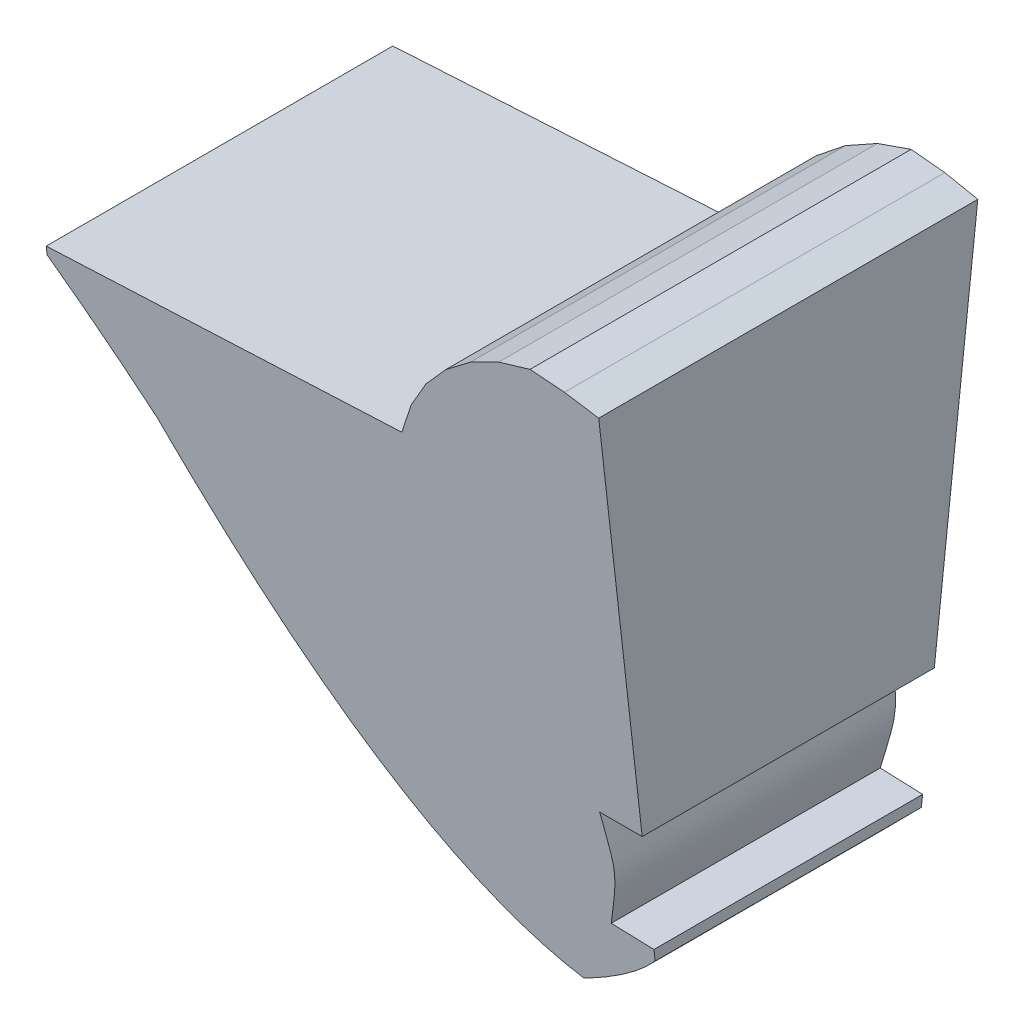
ISO-10303-21;
HEADER;
FILE_DESCRIPTION(('STEP AP214'),'2;1');
FILE_NAME('part.step','',(''),(''),'','','');
FILE_SCHEMA(('AUTOMOTIVE_DESIGN { 1 0 10303 214 1 1 1 1 }'));
ENDSEC;
DATA;
#1=APPLICATION_CONTEXT('core data for automotive mechanical design processes');
#2=APPLICATION_PROTOCOL_DEFINITION('international standard','automotive_design',2000,#1);
#3=PRODUCT_CONTEXT('',#1,'mechanical');
#4=PRODUCT('Part','Part','',(#3));
#5=PRODUCT_RELATED_PRODUCT_CATEGORY('part','',(#4));
#6=PRODUCT_DEFINITION_FORMATION('','',#4);
#7=PRODUCT_DEFINITION_CONTEXT('part definition',#1,'design');
#8=PRODUCT_DEFINITION('design','',#6,#7);
#9=PRODUCT_DEFINITION_SHAPE('','',#8);
#10=(LENGTH_UNIT() NAMED_UNIT(*) SI_UNIT(.MILLI.,.METRE.));
#11=(NAMED_UNIT(*) PLANE_ANGLE_UNIT() SI_UNIT($,.RADIAN.));
#12=(NAMED_UNIT(*) SI_UNIT($,.STERADIAN.) SOLID_ANGLE_UNIT());
#13=UNCERTAINTY_MEASURE_WITH_UNIT(LENGTH_MEASURE(1.E-05),#10,'distance_accuracy_value','');
#14=(GEOMETRIC_REPRESENTATION_CONTEXT(3) GLOBAL_UNCERTAINTY_ASSIGNED_CONTEXT((#13)) GLOBAL_UNIT_ASSIGNED_CONTEXT((#10,
#11,#12)) REPRESENTATION_CONTEXT('',''));
#15=CARTESIAN_POINT('',(0.,0.,0.));
#16=DIRECTION('',(0.,0.,1.));
#17=DIRECTION('',(1.,0.,0.));
#18=AXIS2_PLACEMENT_3D('',#15,#16,#17);
#19=CARTESIAN_POINT('',(0.355125000055651,-1.23774703808888E-13,7.21));
#20=DIRECTION('',(-1.,3.48538412642003E-13,0.));
#21=DIRECTION('',(-3.48538412642003E-13,-1.,0.));
#22=AXIS2_PLACEMENT_3D('',#19,#20,#21);
#23=PLANE('',#22);
#24=DIRECTION('',(0.,-0.993653373689782,0.112485434412263));
#25=VECTOR('',#24,1.);
#26=CARTESIAN_POINT('',(0.355125000056697,12.6081551722012,-7.21));
#27=LINE('',#26,#25);
#28=CARTESIAN_POINT('',(0.355125000056697,17.7734661064821,-7.79473332824248));
#29=VERTEX_POINT('',#28);
#30=CARTESIAN_POINT('',(0.355125000056447,1.97626956518499,-6.00642911422341));
#31=VERTEX_POINT('',#30);
#32=EDGE_CURVE('E56',#29,#31,#27,.T.);
#33=ORIENTED_EDGE('',*,*,#32,.F.);
#34=DIRECTION('',(0.,0.,-1.));
#35=VECTOR('',#34,1.);
#36=CARTESIAN_POINT('',(0.355125000056697,17.7734661064821,25.2255551646788));
#37=LINE('',#36,#35);
#38=CARTESIAN_POINT('',(0.355125000056697,17.7734661064821,7.79473332824248));
#39=VERTEX_POINT('',#38);
#40=EDGE_CURVE('E195',#39,#29,#37,.T.);
#41=ORIENTED_EDGE('',*,*,#40,.F.);
#42=DIRECTION('',(0.,0.993653373689782,0.112485434412263));
#43=VECTOR('',#42,1.);
#44=CARTESIAN_POINT('',(0.355125000056697,12.6081551722012,7.21));
#45=LINE('',#44,#43);
#46=CARTESIAN_POINT('',(0.355125000056697,1.97626956518499,6.00642911422342));
#47=VERTEX_POINT('',#46);
#48=EDGE_CURVE('E242',#47,#39,#45,.T.);
#49=ORIENTED_EDGE('',*,*,#48,.F.);
#50=DIRECTION('',(0.,0.,-1.));
#51=VECTOR('',#50,1.);
#52=CARTESIAN_POINT('',(0.355125000056447,1.97626956518499,7.21));
#53=LINE('',#52,#51);
#54=EDGE_CURVE('E319',#47,#31,#53,.T.);
#55=ORIENTED_EDGE('',*,*,#54,.T.);
#56=EDGE_LOOP('',(#33,#41,#49,#55));
#57=FACE_BOUND('',#56,.T.);
#58=ADVANCED_FACE('F45',(#57),#23,.F.);
#59=CARTESIAN_POINT('',(-23.0359211456035,0.,7.21));
#60=DIRECTION('',(-1.,0.,0.));
#61=DIRECTION('',(0.,0.,1.));
#62=AXIS2_PLACEMENT_3D('',#59,#60,#61);
#63=PLANE('',#62);
#64=DIRECTION('',(0.,0.,-1.));
#65=VECTOR('',#64,1.);
#66=CARTESIAN_POINT('',(-23.0359211456035,11.8716122879342,7.21));
#67=LINE('',#66,#65);
#68=CARTESIAN_POINT('',(-23.0359211456035,11.8716122879342,7.12662047501294));
#69=VERTEX_POINT('',#68);
#70=CARTESIAN_POINT('',(-23.0359211456035,11.8716122879342,-7.12662047501294));
#71=VERTEX_POINT('',#70);
#72=EDGE_CURVE('E321',#69,#71,#67,.T.);
#73=ORIENTED_EDGE('',*,*,#72,.T.);
#74=DIRECTION('',(0.,-0.993653373689782,0.112485434412263));
#75=VECTOR('',#74,1.);
#76=CARTESIAN_POINT('',(-23.0359211456035,12.6081551722012,-7.21));
#77=LINE('',#76,#75);
#78=CARTESIAN_POINT('',(-23.0359211456035,11.5401378200982,-7.08909627341673));
#79=VERTEX_POINT('',#78);
#80=EDGE_CURVE('E237',#71,#79,#77,.T.);
#81=ORIENTED_EDGE('',*,*,#80,.T.);
#82=DIRECTION('',(0.,0.,-1.));
#83=VECTOR('',#82,1.);
#84=CARTESIAN_POINT('',(-23.0359211456035,11.5401378200983,7.21));
#85=LINE('',#84,#83);
#86=CARTESIAN_POINT('',(-23.0359211456035,11.5401378200982,7.08909627341673));
#87=VERTEX_POINT('',#86);
#88=EDGE_CURVE('E320',#87,#79,#85,.T.);
#89=ORIENTED_EDGE('',*,*,#88,.F.);
#90=DIRECTION('',(0.,0.993653373689782,0.112485434412263));
#91=VECTOR('',#90,1.);
#92=CARTESIAN_POINT('',(-23.0359211456035,12.6081551722012,7.21));
#93=LINE('',#92,#91);
#94=EDGE_CURVE('E225',#87,#69,#93,.T.);
#95=ORIENTED_EDGE('',*,*,#94,.T.);
#96=EDGE_LOOP('',(#73,#81,#89,#95));
#97=FACE_BOUND('',#96,.T.);
#98=ADVANCED_FACE('F406',(#97),#63,.T.);
#99=CARTESIAN_POINT('',(-18.9451921135982,7.54091889574655,7.21));
#100=CARTESIAN_POINT('',(-10.2150083842792,-3.69764410322756,7.21));
#101=CARTESIAN_POINT('',(-2.84660482498738,-5.05908110388432,7.21));
#102=(BOUNDED_CURVE() B_SPLINE_CURVE(2,(#99,#100,#101),.UNSPECIFIED.,.F.,
.F.) B_SPLINE_CURVE_WITH_KNOTS((3,3),(0.497667241108509,0.499554279588011),
.UNSPECIFIED.) CURVE() GEOMETRIC_REPRESENTATION_ITEM() RATIONAL_B_SPLINE_CURVE((1.,1.,1.)) REPRESENTATION_ITEM(''));
#103=DIRECTION('',(0.,0.,-1.));
#104=VECTOR('',#103,1.);
#105=SURFACE_OF_LINEAR_EXTRUSION('',#102,#104);
#106=DIRECTION('',(0.,0.,-1.));
#107=VECTOR('',#106,1.);
#108=CARTESIAN_POINT('',(-18.9451921135982,7.54091889574657,7.21));
#109=LINE('',#108,#107);
#110=CARTESIAN_POINT('',(-18.9451921135982,7.54091889574657,6.63636910524442));
#111=VERTEX_POINT('',#110);
#112=CARTESIAN_POINT('',(-18.9451921135982,7.54091889574657,-6.63636910524442));
#113=VERTEX_POINT('',#112);
#114=EDGE_CURVE('E311',#111,#113,#109,.T.);
#115=ORIENTED_EDGE('',*,*,#114,.T.);
#116=CARTESIAN_POINT('',(-18.9451921135982,7.54091889574655,-6.63636910524441));
#117=CARTESIAN_POINT('',(-18.7033608655423,7.22962108931645,-6.60112898035273));
#118=CARTESIAN_POINT('',(-18.4592647140916,6.9200497206851,-6.56608429494821));
#119=CARTESIAN_POINT('',(-17.9661198805234,6.30464603742845,-6.49641819962467));
#120=CARTESIAN_POINT('',(-17.7170694462669,5.99881510969872,-6.46179694670763));
#121=CARTESIAN_POINT('',(-17.2137366178937,5.3913665824337,-6.39303140604553));
#122=CARTESIAN_POINT('',(-16.9594535947769,5.08974949683998,-6.35888717648066));
#123=CARTESIAN_POINT('',(-16.4451285665965,4.49103725761873,-6.29111061767257));
#124=CARTESIAN_POINT('',(-16.1850826962375,4.19394537928884,-6.25747865920581));
#125=CARTESIAN_POINT('',(-15.6590118901181,3.60508061675355,-6.1908168731366));
#126=CARTESIAN_POINT('',(-15.3929875534481,3.31330720485499,-6.15778698579723));
#127=CARTESIAN_POINT('',(-14.8544901847056,2.7357195544677,-6.09240181277284));
#128=CARTESIAN_POINT('',(-14.5820174931064,2.44990500284308,-6.06004649163962));
#129=CARTESIAN_POINT('',(-13.9777704357619,1.83142011947111,-5.99003159245484));
#130=CARTESIAN_POINT('',(-13.6445482479649,1.50014167377654,-5.95252958132897));
#131=CARTESIAN_POINT('',(-12.9673134934436,0.848664446736888,-5.87877982026175));
#132=CARTESIAN_POINT('',(-12.623301443116,0.528465136688492,-5.84253201046914));
#133=CARTESIAN_POINT('',(-11.9227759490938,-0.0995013958587514,-5.7714437516454));
#134=CARTESIAN_POINT('',(-11.5662405708663,-0.407244542107335,-5.73660602813964));
#135=CARTESIAN_POINT('',(-10.840142749037,-1.00720368374379,-5.66868831511867));
#136=CARTESIAN_POINT('',(-10.4705807273197,-1.29942018121482,-5.6356082687657));
#137=CARTESIAN_POINT('',(-9.71382699072171,-1.86779135556405,-5.57126643674768));
#138=CARTESIAN_POINT('',(-9.32650636654571,-2.14377746328672,-5.540023733768));
#139=CARTESIAN_POINT('',(-8.5360986768139,-2.67282289543975,-5.48013372902864));
#140=CARTESIAN_POINT('',(-8.13300835344273,-2.92587744631612,-5.45148696765387));
#141=CARTESIAN_POINT('',(-7.31201826568453,-3.40280761684766,-5.39749661363601));
#142=CARTESIAN_POINT('',(-6.89419365451789,-3.62680992502778,-5.37213867935817));
#143=CARTESIAN_POINT('',(-6.04187322097519,-4.0405536088069,-5.32530128189388));
#144=CARTESIAN_POINT('',(-5.60738935372736,-4.23031901573022,-5.30381909826786));
#145=CARTESIAN_POINT('',(-4.78985442909107,-4.54236533838515,-5.26849423842238));
#146=CARTESIAN_POINT('',(-4.4091055725695,-4.67052923075731,-5.25398558631979));
#147=CARTESIAN_POINT('',(-3.82960691198316,-4.83674345690554,-5.23516948814227));
#148=CARTESIAN_POINT('',(-3.63462104960687,-4.8878904691115,-5.22937944702812));
#149=CARTESIAN_POINT('',(-3.24229120544362,-4.9807402777546,-5.21886848683127));
#150=CARTESIAN_POINT('',(-3.0449461414238,-5.02243854990591,-5.21414807991536));
#151=CARTESIAN_POINT('',(-2.84660482498738,-5.05908110388432,-5.21));
#152=B_SPLINE_CURVE_WITH_KNOTS('',3,(#116,#117,#118,#119,#120,#121,#122,#123,#124,#125,#126,
#127,#128,#129,#130,#131,#132,#133,#134,#135,#136,#137,#138,#139,#140,#141,#142,#143,#144,#145,
#146,#147,#148,#149,#150,#151),.UNSPECIFIED.,.F.,.F.,(4,2,2,2,2,2,2,2,2,2,2,2,2,2,2,2,2,4),(0.,
1.1872997216569,2.37502708567824,3.56289806807204,4.75159146291787,5.9401662676152,
7.12867845491363,8.54255640265696,9.95636678593971,11.3727907462706,12.7891688759803,
14.2183172044781,15.6477623519031,17.0707480146133,18.4927309460623,19.6971402338765,
20.3019233237111,20.9069953892921),.UNSPECIFIED.);
#153=CARTESIAN_POINT('',(-2.84660482498738,-5.05908110388432,-5.21));
#154=VERTEX_POINT('',#153);
#155=EDGE_CURVE('E357',#113,#154,#152,.T.);
#156=ORIENTED_EDGE('',*,*,#155,.T.);
#157=DIRECTION('',(0.,0.,-1.));
#158=VECTOR('',#157,1.);
#159=CARTESIAN_POINT('',(-2.84660482498738,-5.05908110388432,7.21));
#160=LINE('',#159,#158);
#161=CARTESIAN_POINT('',(-2.84660482498738,-5.05908110388432,5.21));
#162=VERTEX_POINT('',#161);
#163=EDGE_CURVE('E337',#162,#154,#160,.T.);
#164=ORIENTED_EDGE('',*,*,#163,.F.);
#165=CARTESIAN_POINT('',(-2.84660482498738,-5.05908110388432,5.21));
#166=CARTESIAN_POINT('',(-3.0836355452615,-5.01529762547054,5.21495646039138));
#167=CARTESIAN_POINT('',(-3.31925014057108,-4.96428184629726,5.22073164541478));
#168=CARTESIAN_POINT('',(-3.78628189704186,-4.84911384389608,5.23376911212451));
#169=CARTESIAN_POINT('',(-4.01771143135529,-4.78501130060695,5.24102576984815));
#170=CARTESIAN_POINT('',(-4.47638324853452,-4.64477679089168,5.25690086287615));
#171=CARTESIAN_POINT('',(-4.70363211310206,-4.56866593727755,5.26551690812791));
#172=CARTESIAN_POINT('',(-5.1539801611568,-4.40545252874729,5.28399330205617));
#173=CARTESIAN_POINT('',(-5.37708095327682,-4.31835434125152,5.29385315632366));
#174=CARTESIAN_POINT('',(-5.81545834234536,-4.13567110279715,5.31453361087802));
#175=CARTESIAN_POINT('',(-6.03080317783365,-4.04024711994086,5.32533597762798));
#176=CARTESIAN_POINT('',(-6.45748946905634,-3.84057736608456,5.34793937192645));
#177=CARTESIAN_POINT('',(-6.66882789943329,-3.73632522989765,5.35974112003892));
#178=CARTESIAN_POINT('',(-7.08747417766979,-3.51983158147829,5.38424904476877));
#179=CARTESIAN_POINT('',(-7.29477947597257,-3.40758521204135,5.39695577124062));
#180=CARTESIAN_POINT('',(-7.70530843131035,-3.17590609220346,5.42318275051655));
#181=CARTESIAN_POINT('',(-7.90853147430462,-3.0564722713248,5.43670312450288));
#182=CARTESIAN_POINT('',(-8.45410340689061,-2.72385368196738,5.47435684511425));
#183=CARTESIAN_POINT('',(-8.79259906035209,-2.50440768840731,5.49919898682003));
#184=CARTESIAN_POINT('',(-9.45845448583479,-2.04949644973372,5.5506967119384));
#185=CARTESIAN_POINT('',(-9.78581359629267,-1.81403025542841,5.5773524028032));
#186=CARTESIAN_POINT('',(-10.4302582396863,-1.32938575303013,5.63221604925302));
#187=CARTESIAN_POINT('',(-10.7473396395034,-1.08020203459831,5.66042461730948));
#188=CARTESIAN_POINT('',(-11.3718438106499,-0.570176876647104,5.71816145288252));
#189=CARTESIAN_POINT('',(-11.6792662750814,-0.309335067346119,5.74768976225981));
#190=CARTESIAN_POINT('',(-12.2887351366992,0.225514030316342,5.80823676455314));
#191=CARTESIAN_POINT('',(-12.5906756597182,0.499640146613562,5.83926890925461));
#192=CARTESIAN_POINT('',(-13.1859914625247,1.05668157973797,5.90232817041119));
#193=CARTESIAN_POINT('',(-13.4793699933214,1.33959347409339,5.93435489942917));
#194=CARTESIAN_POINT('',(-14.0582984741035,1.91313890151101,5.99928247705986));
#195=CARTESIAN_POINT('',(-14.3438493181123,2.20377154523463,6.03218322499598));
#196=CARTESIAN_POINT('',(-14.9077244427009,2.7918210558895,6.09875272137508));
#197=CARTESIAN_POINT('',(-15.1860493084316,3.08923736980037,6.13242140721399));
#198=CARTESIAN_POINT('',(-15.7683607406539,3.72540309630891,6.20443784674841));
#199=CARTESIAN_POINT('',(-16.0715178451228,4.06490144250158,6.24287038264565));
#200=CARTESIAN_POINT('',(-16.6701836985208,4.7504922746204,6.32048193675692));
#201=CARTESIAN_POINT('',(-16.9656923307507,5.09658486102068,6.35966096634501));
#202=CARTESIAN_POINT('',(-17.4495199616275,5.67490501691598,6.42512906184765));
#203=CARTESIAN_POINT('',(-17.6398456690967,5.90547984199544,6.45123103065322));
#204=CARTESIAN_POINT('',(-18.0176052393411,6.36895711711416,6.50369846448112));
#205=CARTESIAN_POINT('',(-18.205039097963,6.60185957049552,6.5300639298818));
#206=CARTESIAN_POINT('',(-18.5771476687389,7.06981539005112,6.58303835239394));
#207=CARTESIAN_POINT('',(-18.7618224957771,7.30486866600559,6.60964729929217));
#208=CARTESIAN_POINT('',(-18.9451921135982,7.54091889574655,6.63636910524441));
#209=B_SPLINE_CURVE_WITH_KNOTS('',3,(#165,#166,#167,#168,#169,#170,#171,#172,#173,#174,#175,
#176,#177,#178,#179,#180,#181,#182,#183,#184,#185,#186,#187,#188,#189,#190,#191,#192,#193,#194,
#195,#196,#197,#198,#199,#200,#201,#202,#203,#204,#205,#206,#207,#208),.UNSPECIFIED.,.F.,.F.,(4,
2,2,2,2,2,2,2,2,2,2,2,2,2,2,2,2,2,2,2,2,4),(0.,0.723070627629283,1.44344574109941,
2.16256813451498,2.88140557514503,3.58855192345824,4.2962125448096,5.0043068623572,
5.71250690363926,6.92441762508089,8.13640021448464,9.3488642962315,10.5613668633146,
11.788141520998,13.0144441434254,14.2406061176645,15.4666684871313,16.8368576095009,
18.2070676256843,19.1073954524656,20.0077245721621,20.9080160976373),.UNSPECIFIED.);
#210=EDGE_CURVE('E271',#162,#111,#209,.T.);
#211=ORIENTED_EDGE('',*,*,#210,.T.);
#212=EDGE_LOOP('',(#115,#156,#164,#211));
#213=FACE_BOUND('',#212,.T.);
#214=ADVANCED_FACE('F42',(#213),#105,.F.);
#215=CARTESIAN_POINT('',(-2.84660482498738,-5.05908110388432,7.21));
#216=CARTESIAN_POINT('',(-0.742366881974002,-3.93520659958673,7.21));
#217=CARTESIAN_POINT('',(0.355124999965198,-2.72325322699678,7.21));
#218=(BOUNDED_CURVE() B_SPLINE_CURVE(2,(#215,#216,#217),.UNSPECIFIED.,.F.,
.F.) B_SPLINE_CURVE_WITH_KNOTS((3,3),(0.498812074629495,0.499412845463797),
.UNSPECIFIED.) CURVE() GEOMETRIC_REPRESENTATION_ITEM() RATIONAL_B_SPLINE_CURVE((1.,1.,1.)) REPRESENTATION_ITEM(''));
#219=DIRECTION('',(0.,0.,-1.));
#220=VECTOR('',#219,1.);
#221=SURFACE_OF_LINEAR_EXTRUSION('',#218,#220);
#222=ORIENTED_EDGE('',*,*,#163,.T.);
#223=CARTESIAN_POINT('',(-2.84660482498738,-5.05908110388432,-5.21));
#224=CARTESIAN_POINT('',(-2.67154367534484,-4.96554243060771,-5.22058894235803));
#225=CARTESIAN_POINT('',(-2.49778385523126,-4.86952307483158,-5.23145870764283));
#226=CARTESIAN_POINT('',(-2.15332890723938,-4.67164155861341,-5.25385966647147));
#227=CARTESIAN_POINT('',(-1.9826387176766,-4.56977092703724,-5.26539181898071));
#228=CARTESIAN_POINT('',(-1.64527137465746,-4.35955519460265,-5.2891890591545));
#229=CARTESIAN_POINT('',(-1.47859514121983,-4.25120862887406,-5.30145431264808));
#230=CARTESIAN_POINT('',(-1.15044448784201,-4.02724001195876,-5.32680843294344));
#231=CARTESIAN_POINT('',(-0.98896568487432,-3.911624347545,-5.33989657673763));
#232=CARTESIAN_POINT('',(-0.724614348138144,-3.7114805449727,-5.36255363519824));
#233=CARTESIAN_POINT('',(-0.619967455079453,-3.6292658395869,-5.37186066025876));
#234=CARTESIAN_POINT('',(-0.414118763296717,-3.46070156785231,-5.39094279275538));
#235=CARTESIAN_POINT('',(-0.312916415666604,-3.3743526656372,-5.40071782500895));
#236=CARTESIAN_POINT('',(-0.114288127047668,-3.19685300163986,-5.42081147873311));
#237=CARTESIAN_POINT('',(-0.0168745915935634,-3.10568844995875,-5.431131661274));
#238=CARTESIAN_POINT('',(0.173044677325633,-2.91833195578561,-5.45234114658855));
#239=CARTESIAN_POINT('',(0.265547074526193,-2.82213668167119,-5.46323082651485));
#240=CARTESIAN_POINT('',(0.355124999965198,-2.72325322699678,-5.47442481895704));
#241=B_SPLINE_CURVE_WITH_KNOTS('',3,(#223,#224,#225,#226,#227,#228,#229,#230,#231,#232,#233,
#234,#235,#236,#237,#238,#239,#240),.UNSPECIFIED.,.F.,.F.,(4,2,2,2,2,2,2,2,4),(0.,
0.596333361221147,1.19355295493407,1.79090815604603,2.38774565156578,2.78786762990545,
3.18792554534165,3.58919872466333,3.99074110013676),.UNSPECIFIED.);
#242=CARTESIAN_POINT('',(0.355125000010947,-2.72325322699678,-5.47442481895703));
#243=VERTEX_POINT('',#242);
#244=EDGE_CURVE('E364',#154,#243,#241,.T.);
#245=ORIENTED_EDGE('',*,*,#244,.T.);
#246=DIRECTION('',(0.,0.,-1.));
#247=VECTOR('',#246,1.);
#248=CARTESIAN_POINT('',(0.355124999965198,-2.72325322699678,7.21));
#249=LINE('',#248,#247);
#250=CARTESIAN_POINT('',(0.355125000010947,-2.72325322699678,5.47442481895703));
#251=VERTEX_POINT('',#250);
#252=EDGE_CURVE('E331',#251,#243,#249,.T.);
#253=ORIENTED_EDGE('',*,*,#252,.F.);
#254=CARTESIAN_POINT('',(0.355124999965198,-2.72325322699678,5.47442481895703));
#255=CARTESIAN_POINT('',(0.288265800066398,-2.79707578870119,5.46606781726749));
#256=CARTESIAN_POINT('',(0.219762299322532,-2.86939557158838,5.45788093599675));
#257=CARTESIAN_POINT('',(0.0798741499126208,-3.0111837154317,5.44182996553056));
#258=CARTESIAN_POINT('',(0.00849051694650479,-3.08065306448068,5.43396576447915));
#259=CARTESIAN_POINT('',(-0.209110404202349,-3.28478130911614,5.41085765164865));
#260=CARTESIAN_POINT('',(-0.359086186155244,-3.41549544786354,5.39606030171743));
#261=CARTESIAN_POINT('',(-0.666431647279958,-3.66745151891472,5.36753789253992));
#262=CARTESIAN_POINT('',(-0.823790135326829,-3.78870709059741,5.35381128926277));
#263=CARTESIAN_POINT('',(-1.14463764434189,-4.02329424679429,5.32725510893767));
#264=CARTESIAN_POINT('',(-1.30813354467851,-4.13661650521983,5.31442658763929));
#265=CARTESIAN_POINT('',(-1.58497175174893,-4.31986712055689,5.29368190381061));
#266=CARTESIAN_POINT('',(-1.69701528140079,-4.39175032218513,5.28554444523986));
#267=CARTESIAN_POINT('',(-1.92294333828473,-4.53261962763427,5.26959749086083));
#268=CARTESIAN_POINT('',(-2.03682799400811,-4.6016055280346,5.26178801808056));
#269=CARTESIAN_POINT('',(-2.26591352019373,-4.73675126913538,5.24648899349189));
#270=CARTESIAN_POINT('',(-2.38111062922232,-4.80291742324192,5.23899872698133));
#271=CARTESIAN_POINT('',(-2.6128736149529,-4.93278949726635,5.22429670205848));
#272=CARTESIAN_POINT('',(-2.72943923096306,-4.99649587614853,5.21708489168965));
#273=CARTESIAN_POINT('',(-2.84660482498738,-5.05908110388432,5.21));
#274=B_SPLINE_CURVE_WITH_KNOTS('',3,(#254,#255,#256,#257,#258,#259,#260,#261,#262,#263,#264,
#265,#266,#267,#268,#269,#270,#271,#272,#273),.UNSPECIFIED.,.F.,.F.,(4,2,2,2,2,2,2,2,2,4),(0.,
0.299782926841572,0.599461041577767,1.1974499434567,1.79455995327913,2.39236050766276,
2.79242459253001,3.19251671924541,3.59166012626068,3.99072869445439),.UNSPECIFIED.);
#275=EDGE_CURVE('E278',#251,#162,#274,.T.);
#276=ORIENTED_EDGE('',*,*,#275,.T.);
#277=EDGE_LOOP('',(#222,#245,#253,#276));
#278=FACE_BOUND('',#277,.T.);
#279=ADVANCED_FACE('F288',(#278),#221,.F.);
#280=CARTESIAN_POINT('',(0.355125000532009,-7.39148800447813E-11,7.21));
#281=DIRECTION('',(1.,-2.08137641489758E-10,0.));
#282=DIRECTION('',(2.08137641489758E-10,1.,0.));
#283=AXIS2_PLACEMENT_3D('',#280,#281,#282);
#284=PLANE('',#283);
#285=CARTESIAN_POINT('',(0.355125000056697,-2.28484178142546,-5.52405470319249));
#286=VERTEX_POINT('',#285);
#287=EDGE_CURVE('E236',#286,#243,#27,.T.);
#288=ORIENTED_EDGE('',*,*,#287,.F.);
#289=DIRECTION('',(0.,0.,-1.));
#290=VECTOR('',#289,1.);
#291=CARTESIAN_POINT('',(0.355125000056447,-2.28484178142545,7.21));
#292=LINE('',#291,#290);
#293=CARTESIAN_POINT('',(0.355125000056697,-2.28484178142546,5.52405470319249));
#294=VERTEX_POINT('',#293);
#295=EDGE_CURVE('E327',#294,#286,#292,.T.);
#296=ORIENTED_EDGE('',*,*,#295,.F.);
#297=EDGE_CURVE('E238',#251,#294,#45,.T.);
#298=ORIENTED_EDGE('',*,*,#297,.F.);
#299=ORIENTED_EDGE('',*,*,#252,.T.);
#300=EDGE_LOOP('',(#288,#296,#298,#299));
#301=FACE_BOUND('',#300,.T.);
#302=ADVANCED_FACE('F295',(#301),#284,.T.);
#303=CARTESIAN_POINT('',(-0.0792587195419091,-2.26967276768239,7.21));
#304=DIRECTION('',(-0.0348994967024901,-0.999390827019096,0.));
#305=DIRECTION('',(0.999390827019096,-0.0348994967024901,0.));
#306=AXIS2_PLACEMENT_3D('',#303,#304,#305);
#307=PLANE('',#306);
#308=ORIENTED_EDGE('',*,*,#295,.T.);
#309=DIRECTION('',(-0.999383027616045,0.034899224341334,-0.00395072820626436));
#310=VECTOR('',#309,1.);
#311=CARTESIAN_POINT('',(-0.0289741896082848,-2.2714287421612,-5.52557311151111));
#312=LINE('',#311,#310);
#313=CARTESIAN_POINT('',(-1.39487499994356,-2.22373043481491,-5.5309727457947));
#314=VERTEX_POINT('',#313);
#315=EDGE_CURVE('E350',#286,#314,#312,.T.);
#316=ORIENTED_EDGE('',*,*,#315,.T.);
#317=DIRECTION('',(0.,0.,-1.));
#318=VECTOR('',#317,1.);
#319=CARTESIAN_POINT('',(-1.39487499994356,-2.22373043481491,7.21));
#320=LINE('',#319,#318);
#321=CARTESIAN_POINT('',(-1.39487499994356,-2.22373043481491,5.5309727457947));
#322=VERTEX_POINT('',#321);
#323=EDGE_CURVE('E326',#322,#314,#320,.T.);
#324=ORIENTED_EDGE('',*,*,#323,.F.);
#325=DIRECTION('',(0.999383027616045,-0.034899224341334,-0.00395072820626436));
#326=VECTOR('',#325,1.);
#327=CARTESIAN_POINT('',(-0.0859085417339361,-2.26944055077446,5.52579818252456));
#328=LINE('',#327,#326);
#329=EDGE_CURVE('E254',#322,#294,#328,.T.);
#330=ORIENTED_EDGE('',*,*,#329,.T.);
#331=EDGE_LOOP('',(#308,#316,#324,#330));
#332=FACE_BOUND('',#331,.T.);
#333=ADVANCED_FACE('F416',(#332),#307,.F.);
#334=CARTESIAN_POINT('',(-1.39487499994356,-2.22373043481491,7.21));
#335=CARTESIAN_POINT('',(-0.907530669798052,-0.123730434814926,7.21));
#336=CARTESIAN_POINT('',(-1.39487499994356,1.976269565185,7.21));
#337=(BOUNDED_CURVE() B_SPLINE_CURVE(2,(#334,#335,#336),.UNSPECIFIED.,.F.,
.F.) B_SPLINE_CURVE_WITH_KNOTS((3,3),(0.,1.),
.UNSPECIFIED.) CURVE() GEOMETRIC_REPRESENTATION_ITEM() RATIONAL_B_SPLINE_CURVE((1.,
3.23180121851367,1.)) REPRESENTATION_ITEM(''));
#338=DIRECTION('',(0.,0.,-1.));
#339=VECTOR('',#338,1.);
#340=SURFACE_OF_LINEAR_EXTRUSION('',#337,#339);
#341=ORIENTED_EDGE('',*,*,#323,.T.);
#342=CARTESIAN_POINT('',(-1.39487499994356,-2.22373043481491,-5.5309727457947));
#343=CARTESIAN_POINT('',(-1.38202447122813,-2.16835021356968,-5.53724200266994));
#344=CARTESIAN_POINT('',(-1.36921744547373,-2.11295996104296,-5.54351239512535));
#345=CARTESIAN_POINT('',(-1.34371955909939,-2.00215267308472,-5.55605621196536));
#346=CARTESIAN_POINT('',(-1.33102869927897,-1.94673563747162,-5.56232963637053));
#347=CARTESIAN_POINT('',(-1.30579250980865,-1.83586894873068,-5.57488017761064));
#348=CARTESIAN_POINT('',(-1.29324717983284,-1.78041929567618,-5.58115729443729));
#349=CARTESIAN_POINT('',(-1.26834035470031,-1.66945670178657,-5.593718692514));
#350=CARTESIAN_POINT('',(-1.25597893242913,-1.61394374477822,-5.60000297559494));
#351=CARTESIAN_POINT('',(-1.23150428056634,-1.50286329328951,-5.61257771561119));
#352=CARTESIAN_POINT('',(-1.21939105277074,-1.44729579841754,-5.61886817259083));
#353=CARTESIAN_POINT('',(-1.19550012207595,-1.33608743052918,-5.63145739324204));
#354=CARTESIAN_POINT('',(-1.1837224309966,-1.2804465549999,-5.63775615719808));
#355=CARTESIAN_POINT('',(-1.15485704104805,-1.14125615214793,-5.65351305326002));
#356=CARTESIAN_POINT('',(-1.13805530724695,-1.05764770999797,-5.66297785475397));
#357=CARTESIAN_POINT('',(-1.10616760722362,-0.890046794372652,-5.68195093158457));
#358=CARTESIAN_POINT('',(-1.09108267359643,-0.806054121054038,-5.69145922954426));
#359=CARTESIAN_POINT('',(-1.06839764881353,-0.664871544058104,-5.70744164748328));
#360=CARTESIAN_POINT('',(-1.05995626751594,-0.607817685780514,-5.71390036659317));
#361=CARTESIAN_POINT('',(-1.04516806244473,-0.493450404650502,-5.72684718853439));
#362=CARTESIAN_POINT('',(-1.03882061818002,-0.436137063802354,-5.73333528208253));
#363=CARTESIAN_POINT('',(-1.02903068414648,-0.32130807468907,-5.74633437116685));
#364=CARTESIAN_POINT('',(-1.02558541499307,-0.263792673078832,-5.75284533878074));
#365=CARTESIAN_POINT('',(-1.02222407231355,-0.148714957691158,-5.76587258464866));
#366=CARTESIAN_POINT('',(-1.02230420900467,-0.0911527608046728,-5.77238884967019));
#367=CARTESIAN_POINT('',(-1.02596900528622,0.0239015023985969,-5.78541344065945));
#368=CARTESIAN_POINT('',(-1.02955657044098,0.0813934710005598,-5.79192175556548));
#369=CARTESIAN_POINT('',(-1.03959132289802,0.19613338530381,-5.80491076103415));
#370=CARTESIAN_POINT('',(-1.04603929917214,0.253381259276289,-5.81139144347682));
#371=CARTESIAN_POINT('',(-1.05997220439613,0.35983137212623,-5.8234420111136));
#372=CARTESIAN_POINT('',(-1.06719667195452,0.409068491171902,-5.82901584487869));
#373=CARTESIAN_POINT('',(-1.08274764683563,0.507347946837772,-5.84014146227917));
#374=CARTESIAN_POINT('',(-1.0910737056158,0.556390354412903,-5.84569325394695));
#375=CARTESIAN_POINT('',(-1.10853037258208,0.654424381213792,-5.85679108784343));
#376=CARTESIAN_POINT('',(-1.11766242226862,0.70341574413319,-5.86233710105724));
#377=CARTESIAN_POINT('',(-1.1364977866421,0.801294033672846,-5.8734173048888));
#378=CARTESIAN_POINT('',(-1.14620115522269,0.850180949988233,-5.87895149433999));
#379=CARTESIAN_POINT('',(-1.16833495400599,0.959258362431623,-5.89129948252998));
#380=CARTESIAN_POINT('',(-1.1808737668477,1.01942705832357,-5.89811081339709));
#381=CARTESIAN_POINT('',(-1.20639174214038,1.13967062360228,-5.91172285360526));
#382=CARTESIAN_POINT('',(-1.21937089694786,1.19974549459873,-5.91852356312855));
#383=CARTESIAN_POINT('',(-1.24564626429316,1.31982703510014,-5.93211726150049));
#384=CARTESIAN_POINT('',(-1.2589424791072,1.37983370411223,-5.93891025029334));
#385=CARTESIAN_POINT('',(-1.28569888355067,1.49948275843749,-5.95245498954463));
#386=CARTESIAN_POINT('',(-1.29915785770072,1.55912541262012,-5.95920677044014));
#387=CARTESIAN_POINT('',(-1.32625009614692,1.67837055204035,-5.97270578495002));
#388=CARTESIAN_POINT('',(-1.33988335761136,1.73797303791406,-5.97945301863641));
#389=CARTESIAN_POINT('',(-1.36728618039678,1.85714403003134,-5.99294363938264));
#390=CARTESIAN_POINT('',(-1.381055735056,1.91671253778666,-5.9996870266136));
#391=CARTESIAN_POINT('',(-1.39487499994356,1.976269565185,-6.00642911422342));
#392=B_SPLINE_CURVE_WITH_KNOTS('',3,(#342,#343,#344,#345,#346,#347,#348,#349,#350,#351,#352,
#353,#354,#355,#356,#357,#358,#359,#360,#361,#362,#363,#364,#365,#366,#367,#368,#369,#370,#371,
#372,#373,#374,#375,#376,#377,#378,#379,#380,#381,#382,#383,#384,#385,#386,#387,#388,#389,#390,
#391),.UNSPECIFIED.,.F.,.F.,(4,2,2,2,2,2,2,2,2,2,2,2,2,2,2,2,2,2,2,2,2,2,2,2,4),(0.,
0.171588763273453,0.343178706622211,0.514768265617105,0.686424107910212,0.858081191922479,
1.02974431538338,1.28714724145325,1.54470417716685,1.71878537631805,1.8928149439917,
2.06667765516018,2.24035346989174,2.41417328020677,2.58804106414591,2.73825198714263,
2.88840193486919,3.03882608638502,3.18926445051695,3.37477476712053,3.56028186526787,
3.74579029559563,3.93033206952695,4.11487084894101,4.29940065253389),.UNSPECIFIED.);
#393=CARTESIAN_POINT('',(-1.39487499994356,1.976269565185,-6.00642911422342));
#394=VERTEX_POINT('',#393);
#395=EDGE_CURVE('E349',#314,#394,#392,.T.);
#396=ORIENTED_EDGE('',*,*,#395,.T.);
#397=DIRECTION('',(0.,0.,-1.));
#398=VECTOR('',#397,1.);
#399=CARTESIAN_POINT('',(-1.39487499994356,1.976269565185,7.21));
#400=LINE('',#399,#398);
#401=CARTESIAN_POINT('',(-1.39487499994356,1.976269565185,6.00642911422342));
#402=VERTEX_POINT('',#401);
#403=EDGE_CURVE('E323',#402,#394,#400,.T.);
#404=ORIENTED_EDGE('',*,*,#403,.F.);
#405=CARTESIAN_POINT('',(-1.39487499994356,1.976269565185,6.00642911422342));
#406=CARTESIAN_POINT('',(-1.37907511533365,1.90817072448153,5.99872006005792));
#407=CARTESIAN_POINT('',(-1.36333836969219,1.84005724657732,5.99100934890426));
#408=CARTESIAN_POINT('',(-1.33204781411177,1.703774616767,5.97558162408294));
#409=CARTESIAN_POINT('',(-1.31649404111311,1.63560545649229,5.96786460946793));
#410=CARTESIAN_POINT('',(-1.28563112684324,1.49920642241426,5.95242370722985));
#411=CARTESIAN_POINT('',(-1.27032200601989,1.43097654403409,5.94469981908867));
#412=CARTESIAN_POINT('',(-1.2399275173513,1.29390485970128,5.92918277022027));
#413=CARTESIAN_POINT('',(-1.22484485449072,1.22506245970345,5.92138954224482));
#414=CARTESIAN_POINT('',(-1.19518112320204,1.0872751663326,5.90579148364441));
#415=CARTESIAN_POINT('',(-1.18060002365467,1.01833027959621,5.89798665377074));
#416=CARTESIAN_POINT('',(-1.1521828568661,0.880291295746957,5.88236010282727));
#417=CARTESIAN_POINT('',(-1.13834675067045,0.81119720663251,5.87453838266293));
#418=CARTESIAN_POINT('',(-1.11516473949854,0.690174385789182,5.86083812768789));
#419=CARTESIAN_POINT('',(-1.10556404533104,0.638294159941606,5.85496508393199));
#420=CARTESIAN_POINT('',(-1.08728934318226,0.534373551286744,5.8432008660282));
#421=CARTESIAN_POINT('',(-1.07861528667302,0.482333177013413,5.83730969284637));
#422=CARTESIAN_POINT('',(-1.06260440200736,0.378149691610768,5.82551571627023));
#423=CARTESIAN_POINT('',(-1.05526500549272,0.326006977236309,5.81961295779011));
#424=CARTESIAN_POINT('',(-1.04244257361275,0.221494061638693,5.80778168843203));
#425=CARTESIAN_POINT('',(-1.03695934618146,0.169123884520429,5.80185318028283));
#426=CARTESIAN_POINT('',(-1.02917052981484,0.0729301509045451,5.79096367474698));
#427=CARTESIAN_POINT('',(-1.02648754730517,0.029137538921467,5.78600618039996));
#428=CARTESIAN_POINT('',(-1.02311803398459,-0.0585228047861233,5.77608268785843));
#429=CARTESIAN_POINT('',(-1.02243133042271,-0.10239052968188,5.77111669043696));
#430=CARTESIAN_POINT('',(-1.02313587995194,-0.190112899664058,5.76118617627941));
#431=CARTESIAN_POINT('',(-1.02452732528276,-0.233967543165022,5.75622165972282));
#432=CARTESIAN_POINT('',(-1.02922830316647,-0.321575626235211,5.74630408328911));
#433=CARTESIAN_POINT('',(-1.03253802615093,-0.365329055323648,5.74135102459847));
#434=CARTESIAN_POINT('',(-1.04481913269156,-0.496026010219698,5.72655561994619));
#435=CARTESIAN_POINT('',(-1.05614963950478,-0.582745183351363,5.71673867158183));
#436=CARTESIAN_POINT('',(-1.08246686740171,-0.755641929816293,5.69716608606103));
#437=CARTESIAN_POINT('',(-1.09745579058543,-0.84181914476287,5.68741048947536));
#438=CARTESIAN_POINT('',(-1.129420439335,-1.01366509487317,5.66795685819712));
#439=CARTESIAN_POINT('',(-1.14639302616418,-1.09933441387988,5.65825875741124));
#440=CARTESIAN_POINT('',(-1.18149622255001,-1.27039766561497,5.63889373063944));
#441=CARTESIAN_POINT('',(-1.19962634896168,-1.35579169781193,5.62922679339328));
#442=CARTESIAN_POINT('',(-1.24641099322308,-1.57177275123237,5.60477689641502));
#443=CARTESIAN_POINT('',(-1.2755379218154,-1.70225834502177,5.59000541866374));
#444=CARTESIAN_POINT('',(-1.31987060164556,-1.89787014932725,5.56786140006925));
#445=CARTESIAN_POINT('',(-1.33475842772637,-1.96306843680887,5.56048069983263));
#446=CARTESIAN_POINT('',(-1.36470186719661,-2.09342597092531,5.54572371893541));
#447=CARTESIAN_POINT('',(-1.37975747811874,-2.15858521811941,5.53834743821149));
#448=CARTESIAN_POINT('',(-1.39487499994356,-2.22373043481491,5.5309727457947));
#449=B_SPLINE_CURVE_WITH_KNOTS('',3,(#405,#406,#407,#408,#409,#410,#411,#412,#413,#414,#415,
#416,#417,#418,#419,#420,#421,#422,#423,#424,#425,#426,#427,#428,#429,#430,#431,#432,#433,#434,
#435,#436,#437,#438,#439,#440,#441,#442,#443,#444,#445,#446,#447,#448),.UNSPECIFIED.,.F.,.F.,(4,
2,2,2,2,2,2,2,2,2,2,2,2,2,2,2,2,2,2,2,2,4),(0.,0.210994688118994,0.422031267037357,
0.633085392962154,0.845798629208893,1.05849864386888,1.27118752598179,1.4304428147189,
1.58968975917224,1.7486269361582,1.90754766218714,2.03996993828288,2.1723807546786,
2.3048038205294,2.43724003455642,2.70109168787962,2.96510255404671,3.22870119353186,
3.49219051999256,3.89571487778355,4.09756249770236,4.29940715332609),.UNSPECIFIED.);
#450=EDGE_CURVE('E69',#402,#322,#449,.T.);
#451=ORIENTED_EDGE('',*,*,#450,.T.);
#452=EDGE_LOOP('',(#341,#396,#404,#451));
#453=FACE_BOUND('',#452,.T.);
#454=ADVANCED_FACE('F253',(#453),#340,.F.);
#455=CARTESIAN_POINT('',(-0.683557287645435,13.0430500394562,7.21));
#456=DIRECTION('',(0.0523359562429403,-0.998629534754574,0.));
#457=DIRECTION('',(0.998629534754574,0.0523359562429403,0.));
#458=AXIS2_PLACEMENT_3D('',#455,#456,#457);
#459=PLANE('',#458);
#460=DIRECTION('',(0.998612008623237,0.0523350377373175,0.00592453023432517));
#461=VECTOR('',#460,1.);
#462=CARTESIAN_POINT('',(-0.683848558053945,13.0430347746209,7.25923006582624));
#463=LINE('',#462,#461);
#464=CARTESIAN_POINT('',(-8.32331873887405,12.6426671075451,7.2139068855824));
#465=VERTEX_POINT('',#464);
#466=EDGE_CURVE('E290',#69,#465,#463,.T.);
#467=ORIENTED_EDGE('',*,*,#466,.T.);
#468=DIRECTION('',(0.,0.,-1.));
#469=VECTOR('',#468,1.);
#470=CARTESIAN_POINT('',(-8.32331873887405,12.6426671075451,25.2255551646788));
#471=LINE('',#470,#469);
#472=CARTESIAN_POINT('',(-8.32331873887405,12.6426671075451,-7.2139068855824));
#473=VERTEX_POINT('',#472);
#474=EDGE_CURVE('E199',#465,#473,#471,.T.);
#475=ORIENTED_EDGE('',*,*,#474,.T.);
#476=DIRECTION('',(-0.998612008623237,-0.0523350377373175,0.00592453023432517));
#477=VECTOR('',#476,1.);
#478=CARTESIAN_POINT('',(-0.769161705533953,13.0385637020178,-7.25872392298271));
#479=LINE('',#478,#477);
#480=EDGE_CURVE('E371',#473,#71,#479,.T.);
#481=ORIENTED_EDGE('',*,*,#480,.T.);
#482=ORIENTED_EDGE('',*,*,#72,.F.);
#483=EDGE_LOOP('',(#467,#475,#481,#482));
#484=FACE_BOUND('',#483,.T.);
#485=ADVANCED_FACE('F410',(#484),#459,.F.);
#486=CARTESIAN_POINT('',(-69.8841339427642,-40.4718315495759,7.21));
#487=DIRECTION('',(0.,0.,-1.));
#488=DIRECTION('',(-1.,0.,0.));
#489=AXIS2_PLACEMENT_3D('',#486,#487,#488);
#490=CYLINDRICAL_SURFACE('',#489,69.9999999999998);
#491=CARTESIAN_POINT('',(-69.8841339427642,-40.4718315495759,-1.20113863738535));
#492=DIRECTION('',(0.,0.112485434412263,0.993653373689781));
#493=DIRECTION('',(0.,0.993653373689782,-0.112485434412263));
#494=AXIS2_PLACEMENT_3D('',#491,#492,#493);
#495=ELLIPSE('',#494,70.4471014273976,69.9999999999998);
#496=EDGE_CURVE('E348',#113,#79,#495,.T.);
#497=ORIENTED_EDGE('',*,*,#496,.F.);
#498=ORIENTED_EDGE('',*,*,#114,.F.);
#499=CARTESIAN_POINT('',(-69.8841339427642,-40.4718315495759,1.20113863738535));
#500=DIRECTION('',(0.,0.112485434412263,-0.993653373689781));
#501=DIRECTION('',(0.,-0.993653373689782,-0.112485434412263));
#502=AXIS2_PLACEMENT_3D('',#499,#500,#501);
#503=ELLIPSE('',#502,70.4471014273976,69.9999999999998);
#504=EDGE_CURVE('E279',#87,#111,#503,.T.);
#505=ORIENTED_EDGE('',*,*,#504,.F.);
#506=ORIENTED_EDGE('',*,*,#88,.T.);
#507=EDGE_LOOP('',(#497,#498,#505,#506));
#508=FACE_BOUND('',#507,.T.);
#509=ADVANCED_FACE('F414',(#508),#490,.F.);
#510=CARTESIAN_POINT('',(-1.39487499994356,1.976269565185,7.21));
#511=DIRECTION('',(0.,1.,0.));
#512=DIRECTION('',(-1.,0.,0.));
#513=AXIS2_PLACEMENT_3D('',#510,#511,#512);
#514=PLANE('',#513);
#515=ORIENTED_EDGE('',*,*,#403,.T.);
#516=DIRECTION('',(1.,0.,0.));
#517=VECTOR('',#516,1.);
#518=CARTESIAN_POINT('',(-1.39487499994355,1.976269565185,-6.00642911422342));
#519=LINE('',#518,#517);
#520=EDGE_CURVE('E11',#394,#31,#519,.T.);
#521=ORIENTED_EDGE('',*,*,#520,.T.);
#522=ORIENTED_EDGE('',*,*,#54,.F.);
#523=DIRECTION('',(-1.,0.,0.));
#524=VECTOR('',#523,1.);
#525=CARTESIAN_POINT('',(-1.39487499994356,1.976269565185,6.00642911422342));
#526=LINE('',#525,#524);
#527=EDGE_CURVE('E55',#47,#402,#526,.T.);
#528=ORIENTED_EDGE('',*,*,#527,.T.);
#529=EDGE_LOOP('',(#515,#521,#522,#528));
#530=FACE_BOUND('',#529,.T.);
#531=ADVANCED_FACE('F262',(#530),#514,.F.);
#532=CARTESIAN_POINT('',(-23.0359211456035,12.6081551722012,7.21));
#533=DIRECTION('',(0.,0.112485434412263,-0.993653373689781));
#534=DIRECTION('',(0.,0.993653373689782,0.112485434412263));
#535=AXIS2_PLACEMENT_3D('',#532,#533,#534);
#536=PLANE('',#535);
#537=DIRECTION('',(0.37256000977219,0.922118382295776,0.104387394597078));
#538=VECTOR('',#537,1.);
#539=CARTESIAN_POINT('',(-7.62283549315376,14.3764239800657,7.41017492042692));
#540=LINE('',#539,#538);
#541=CARTESIAN_POINT('',(-7.79698330946579,13.9453930093607,7.36138053470985));
#542=VERTEX_POINT('',#541);
#543=EDGE_CURVE('E205',#465,#542,#540,.T.);
#544=ORIENTED_EDGE('',*,*,#543,.F.);
#545=ORIENTED_EDGE('',*,*,#466,.F.);
#546=ORIENTED_EDGE('',*,*,#94,.F.);
#547=ORIENTED_EDGE('',*,*,#504,.T.);
#548=ORIENTED_EDGE('',*,*,#210,.F.);
#549=ORIENTED_EDGE('',*,*,#275,.F.);
#550=ORIENTED_EDGE('',*,*,#297,.T.);
#551=ORIENTED_EDGE('',*,*,#329,.F.);
#552=ORIENTED_EDGE('',*,*,#450,.F.);
#553=ORIENTED_EDGE('',*,*,#527,.F.);
#554=ORIENTED_EDGE('',*,*,#48,.T.);
#555=DIRECTION('',(0.984617531848999,-0.173614636535021,-0.0196538534745276));
#556=VECTOR('',#555,1.);
#557=CARTESIAN_POINT('',(-1.36534307009336,18.0768310466821,7.82907542176059));
#558=LINE('',#557,#556);
#559=CARTESIAN_POINT('',(-1.02856450429051,18.0174478990096,7.82235301801341));
#560=VERTEX_POINT('',#559);
#561=EDGE_CURVE('E217',#560,#39,#558,.T.);
#562=ORIENTED_EDGE('',*,*,#561,.F.);
#563=DIRECTION('',(0.996146214220265,-0.087151500950115,-0.00986588955829881));
#564=VECTOR('',#563,1.);
#565=CARTESIAN_POINT('',(-2.59915320965545,18.1548566057776,7.83790821913493));
#566=LINE('',#565,#564);
#567=CARTESIAN_POINT('',(-2.42825306667104,18.139904780673,7.83621561426216));
#568=VERTEX_POINT('',#567);
#569=EDGE_CURVE('E220',#568,#560,#566,.T.);
#570=ORIENTED_EDGE('',*,*,#569,.F.);
#571=DIRECTION('',(0.950475129122669,0.308828090245699,0.0349605433945242));
#572=VECTOR('',#571,1.);
#573=CARTESIAN_POINT('',(-3.18505508544926,17.8940048986118,7.80837878928076));
#574=LINE('',#573,#572);
#575=CARTESIAN_POINT('',(-3.76452089721717,17.7057250430661,7.78706477586028));
#576=VERTEX_POINT('',#575);
#577=EDGE_CURVE('E172',#576,#568,#574,.T.);
#578=ORIENTED_EDGE('',*,*,#577,.F.);
#579=DIRECTION('',(0.881703286098032,0.468809953145049,0.0530711137632356));
#580=VECTOR('',#579,1.);
#581=CARTESIAN_POINT('',(-4.18560031917461,17.4818331429329,7.76171934020362));
#582=LINE('',#581,#580);
#583=CARTESIAN_POINT('',(-5.00509329663691,17.046100997636,7.71239276320112));
#584=VERTEX_POINT('',#583);
#585=EDGE_CURVE('E213',#584,#576,#582,.T.);
#586=ORIENTED_EDGE('',*,*,#585,.F.);
#587=DIRECTION('',(0.786103843557215,0.61417163391293,0.0695266225362341));
#588=VECTOR('',#587,1.);
#589=CARTESIAN_POINT('',(-5.14973959857932,16.9330909210011,7.69959958209809));
#590=LINE('',#589,#588);
#591=CARTESIAN_POINT('',(-6.11227610032405,16.1810749871999,7.61446844760151));
#592=VERTEX_POINT('',#591);
#593=EDGE_CURVE('E211',#592,#584,#590,.T.);
#594=ORIENTED_EDGE('',*,*,#593,.F.);
#595=DIRECTION('',(0.666775270838004,0.74052896037198,0.0838307643368494));
#596=VECTOR('',#595,1.);
#597=CARTESIAN_POINT('',(-6.06142686477184,16.2375487845737,7.62086150155644));
#598=LINE('',#597,#596);
#599=CARTESIAN_POINT('',(-7.05242811904973,15.1369303893602,7.49626720983881));
#600=VERTEX_POINT('',#599);
#601=EDGE_CURVE('E206',#600,#592,#598,.T.);
#602=ORIENTED_EDGE('',*,*,#601,.F.);
#603=DIRECTION('',(0.527494027973123,0.844166906828326,0.0955629837781698));
#604=VECTOR('',#603,1.);
#605=CARTESIAN_POINT('',(-6.896469859112,15.3865157778278,7.52452124850873));
#606=LINE('',#605,#604);
#607=EDGE_CURVE('E202',#542,#600,#606,.T.);
#608=ORIENTED_EDGE('',*,*,#607,.F.);
#609=EDGE_LOOP('',(#544,#545,#546,#547,#548,#549,#550,#551,#552,#553,#554,#562,#570,#578,#586,
#594,#602,#608));
#610=FACE_BOUND('',#609,.T.);
#611=ADVANCED_FACE('F259',(#610),#536,.F.);
#612=CARTESIAN_POINT('',(-23.0359211456035,12.6081551722012,-7.21));
#613=DIRECTION('',(0.,0.112485434412263,0.993653373689781));
#614=DIRECTION('',(0.,-0.993653373689782,0.112485434412263));
#615=AXIS2_PLACEMENT_3D('',#612,#613,#614);
#616=PLANE('',#615);
#617=ORIENTED_EDGE('',*,*,#480,.F.);
#618=DIRECTION('',(0.37256000977219,0.922118382295776,-0.104387394597078));
#619=VECTOR('',#618,1.);
#620=CARTESIAN_POINT('',(-7.62283549315376,14.3764239800657,-7.41017492042692));
#621=LINE('',#620,#619);
#622=CARTESIAN_POINT('',(-7.79698330946579,13.9453930093607,-7.36138053470984));
#623=VERTEX_POINT('',#622);
#624=EDGE_CURVE('E200',#473,#623,#621,.T.);
#625=ORIENTED_EDGE('',*,*,#624,.T.);
#626=DIRECTION('',(0.527494027973123,0.844166906828326,-0.0955629837781698));
#627=VECTOR('',#626,1.);
#628=CARTESIAN_POINT('',(-6.896469859112,15.3865157778278,-7.52452124850873));
#629=LINE('',#628,#627);
#630=CARTESIAN_POINT('',(-7.05242811904973,15.1369303893602,-7.49626720983882));
#631=VERTEX_POINT('',#630);
#632=EDGE_CURVE('E392',#623,#631,#629,.T.);
#633=ORIENTED_EDGE('',*,*,#632,.T.);
#634=DIRECTION('',(0.666775270838004,0.74052896037198,-0.0838307643368494));
#635=VECTOR('',#634,1.);
#636=CARTESIAN_POINT('',(-6.06142686477184,16.2375487845737,-7.62086150155644));
#637=LINE('',#636,#635);
#638=CARTESIAN_POINT('',(-6.11227610032405,16.1810749871999,-7.6144684476015));
#639=VERTEX_POINT('',#638);
#640=EDGE_CURVE('E389',#631,#639,#637,.T.);
#641=ORIENTED_EDGE('',*,*,#640,.T.);
#642=DIRECTION('',(0.786103843557215,0.61417163391293,-0.0695266225362341));
#643=VECTOR('',#642,1.);
#644=CARTESIAN_POINT('',(-5.14973959857932,16.9330909210011,-7.69959958209809));
#645=LINE('',#644,#643);
#646=CARTESIAN_POINT('',(-5.00509329663691,17.046100997636,-7.71239276320112));
#647=VERTEX_POINT('',#646);
#648=EDGE_CURVE('E593',#639,#647,#645,.T.);
#649=ORIENTED_EDGE('',*,*,#648,.T.);
#650=DIRECTION('',(0.881703286098032,0.468809953145049,-0.0530711137632356));
#651=VECTOR('',#650,1.);
#652=CARTESIAN_POINT('',(-4.18560031917461,17.4818331429329,-7.76171934020362));
#653=LINE('',#652,#651);
#654=CARTESIAN_POINT('',(-3.76452089721717,17.7057250430661,-7.78706477586028));
#655=VERTEX_POINT('',#654);
#656=EDGE_CURVE('E189',#647,#655,#653,.T.);
#657=ORIENTED_EDGE('',*,*,#656,.T.);
#658=DIRECTION('',(0.950475129122669,0.308828090245699,-0.0349605433945242));
#659=VECTOR('',#658,1.);
#660=CARTESIAN_POINT('',(-3.18505508544926,17.8940048986118,-7.80837878928076));
#661=LINE('',#660,#659);
#662=CARTESIAN_POINT('',(-2.42825306667104,18.139904780673,-7.83621561426216));
#663=VERTEX_POINT('',#662);
#664=EDGE_CURVE('E173',#655,#663,#661,.T.);
#665=ORIENTED_EDGE('',*,*,#664,.T.);
#666=DIRECTION('',(0.996146214220265,-0.087151500950115,0.00986588955829881));
#667=VECTOR('',#666,1.);
#668=CARTESIAN_POINT('',(-2.59915320965545,18.1548566057776,-7.83790821913493));
#669=LINE('',#668,#667);
#670=CARTESIAN_POINT('',(-1.02856450429051,18.0174478990096,-7.82235301801341));
#671=VERTEX_POINT('',#670);
#672=EDGE_CURVE('E183',#663,#671,#669,.T.);
#673=ORIENTED_EDGE('',*,*,#672,.T.);
#674=DIRECTION('',(0.984617531848999,-0.173614636535021,0.0196538534745276));
#675=VECTOR('',#674,1.);
#676=CARTESIAN_POINT('',(-1.36534307009336,18.0768310466821,-7.82907542176059));
#677=LINE('',#676,#675);
#678=EDGE_CURVE('E192',#671,#29,#677,.T.);
#679=ORIENTED_EDGE('',*,*,#678,.T.);
#680=ORIENTED_EDGE('',*,*,#32,.T.);
#681=ORIENTED_EDGE('',*,*,#520,.F.);
#682=ORIENTED_EDGE('',*,*,#395,.F.);
#683=ORIENTED_EDGE('',*,*,#315,.F.);
#684=ORIENTED_EDGE('',*,*,#287,.T.);
#685=ORIENTED_EDGE('',*,*,#244,.F.);
#686=ORIENTED_EDGE('',*,*,#155,.F.);
#687=ORIENTED_EDGE('',*,*,#496,.T.);
#688=ORIENTED_EDGE('',*,*,#80,.F.);
#689=EDGE_LOOP('',(#617,#625,#633,#641,#649,#657,#665,#673,#679,#680,#681,#682,#683,#684,#685,
#686,#687,#688));
#690=FACE_BOUND('',#689,.T.);
#691=ADVANCED_FACE('F182',(#690),#616,.F.);
#692=CARTESIAN_POINT('',(-8.32331873887405,12.6426671075451,25.2255551646788));
#693=DIRECTION('',(0.927183854566785,-0.374606593415918,0.));
#694=DIRECTION('',(0.374606593415918,0.927183854566785,0.));
#695=AXIS2_PLACEMENT_3D('',#692,#693,#694);
#696=PLANE('',#695);
#697=ORIENTED_EDGE('',*,*,#474,.F.);
#698=ORIENTED_EDGE('',*,*,#543,.T.);
#699=DIRECTION('',(0.,0.,-1.));
#700=VECTOR('',#699,1.);
#701=CARTESIAN_POINT('',(-7.79698330946579,13.9453930093607,25.2255551646788));
#702=LINE('',#701,#700);
#703=EDGE_CURVE('E228',#542,#623,#702,.T.);
#704=ORIENTED_EDGE('',*,*,#703,.T.);
#705=ORIENTED_EDGE('',*,*,#624,.F.);
#706=EDGE_LOOP('',(#697,#698,#704,#705));
#707=FACE_BOUND('',#706,.T.);
#708=ADVANCED_FACE('F397',(#707),#696,.F.);
#709=CARTESIAN_POINT('',(-7.79698330946579,13.9453930093607,25.2255551646788));
#710=DIRECTION('',(0.848048096156424,-0.529919264233208,0.));
#711=DIRECTION('',(0.529919264233208,0.848048096156424,0.));
#712=AXIS2_PLACEMENT_3D('',#709,#710,#711);
#713=PLANE('',#712);
#714=ORIENTED_EDGE('',*,*,#703,.F.);
#715=ORIENTED_EDGE('',*,*,#607,.T.);
#716=DIRECTION('',(0.,0.,-1.));
#717=VECTOR('',#716,1.);
#718=CARTESIAN_POINT('',(-7.05242811904973,15.1369303893602,25.2255551646788));
#719=LINE('',#718,#717);
#720=EDGE_CURVE('E226',#600,#631,#719,.T.);
#721=ORIENTED_EDGE('',*,*,#720,.T.);
#722=ORIENTED_EDGE('',*,*,#632,.F.);
#723=EDGE_LOOP('',(#714,#715,#721,#722));
#724=FACE_BOUND('',#723,.T.);
#725=ADVANCED_FACE('F393',(#724),#713,.F.);
#726=CARTESIAN_POINT('',(-7.05242811904973,15.1369303893602,25.2255551646788));
#727=DIRECTION('',(0.743144825477695,-0.669130606358525,0.));
#728=DIRECTION('',(0.669130606358525,0.743144825477695,0.));
#729=AXIS2_PLACEMENT_3D('',#726,#727,#728);
#730=PLANE('',#729);
#731=ORIENTED_EDGE('',*,*,#720,.F.);
#732=ORIENTED_EDGE('',*,*,#601,.T.);
#733=DIRECTION('',(0.,0.,-1.));
#734=VECTOR('',#733,1.);
#735=CARTESIAN_POINT('',(-6.11227610032405,16.1810749871999,25.2255551646788));
#736=LINE('',#735,#734);
#737=EDGE_CURVE('E229',#592,#639,#736,.T.);
#738=ORIENTED_EDGE('',*,*,#737,.T.);
#739=ORIENTED_EDGE('',*,*,#640,.F.);
#740=EDGE_LOOP('',(#731,#732,#738,#739));
#741=FACE_BOUND('',#740,.T.);
#742=ADVANCED_FACE('F387',(#741),#730,.F.);
#743=CARTESIAN_POINT('',(-6.11227610032405,16.1810749871999,25.2255551646788));
#744=DIRECTION('',(0.615661475325654,-0.788010753606725,0.));
#745=DIRECTION('',(0.788010753606726,0.615661475325654,0.));
#746=AXIS2_PLACEMENT_3D('',#743,#744,#745);
#747=PLANE('',#746);
#748=ORIENTED_EDGE('',*,*,#737,.F.);
#749=ORIENTED_EDGE('',*,*,#593,.T.);
#750=DIRECTION('',(0.,0.,-1.));
#751=VECTOR('',#750,1.);
#752=CARTESIAN_POINT('',(-5.00509329663691,17.046100997636,25.2255551646788));
#753=LINE('',#752,#751);
#754=EDGE_CURVE('E235',#584,#647,#753,.T.);
#755=ORIENTED_EDGE('',*,*,#754,.T.);
#756=ORIENTED_EDGE('',*,*,#648,.F.);
#757=EDGE_LOOP('',(#748,#749,#755,#756));
#758=FACE_BOUND('',#757,.T.);
#759=ADVANCED_FACE('F384',(#758),#747,.F.);
#760=CARTESIAN_POINT('',(-5.00509329663691,17.046100997636,25.2255551646788));
#761=DIRECTION('',(0.469471562785739,-0.882947592859008,0.));
#762=DIRECTION('',(0.882947592859007,0.469471562785739,0.));
#763=AXIS2_PLACEMENT_3D('',#760,#761,#762);
#764=PLANE('',#763);
#765=ORIENTED_EDGE('',*,*,#754,.F.);
#766=ORIENTED_EDGE('',*,*,#585,.T.);
#767=DIRECTION('',(0.,0.,-1.));
#768=VECTOR('',#767,1.);
#769=CARTESIAN_POINT('',(-3.76452089721717,17.7057250430661,25.2255551646788));
#770=LINE('',#769,#768);
#771=EDGE_CURVE('E177',#576,#655,#770,.T.);
#772=ORIENTED_EDGE('',*,*,#771,.T.);
#773=ORIENTED_EDGE('',*,*,#656,.F.);
#774=EDGE_LOOP('',(#765,#766,#772,#773));
#775=FACE_BOUND('',#774,.T.);
#776=ADVANCED_FACE('F378',(#775),#764,.F.);
#777=CARTESIAN_POINT('',(-3.76452089721717,17.7057250430661,25.2255551646788));
#778=DIRECTION('',(0.309016994387826,-0.951056516290969,0.));
#779=DIRECTION('',(0.951056516290969,0.309016994387826,0.));
#780=AXIS2_PLACEMENT_3D('',#777,#778,#779);
#781=PLANE('',#780);
#782=ORIENTED_EDGE('',*,*,#771,.F.);
#783=ORIENTED_EDGE('',*,*,#577,.T.);
#784=DIRECTION('',(0.,0.,-1.));
#785=VECTOR('',#784,1.);
#786=CARTESIAN_POINT('',(-2.42825306667104,18.139904780673,25.2255551646788));
#787=LINE('',#786,#785);
#788=EDGE_CURVE('E169',#568,#663,#787,.T.);
#789=ORIENTED_EDGE('',*,*,#788,.T.);
#790=ORIENTED_EDGE('',*,*,#664,.F.);
#791=EDGE_LOOP('',(#782,#783,#789,#790));
#792=FACE_BOUND('',#791,.T.);
#793=ADVANCED_FACE('F175',(#792),#781,.F.);
#794=CARTESIAN_POINT('',(-2.42825306667104,18.139904780673,25.2255551646788));
#795=DIRECTION('',(-0.087155742739297,-0.996194698092477,0.));
#796=DIRECTION('',(0.996194698092477,-0.087155742739297,0.));
#797=AXIS2_PLACEMENT_3D('',#794,#795,#796);
#798=PLANE('',#797);
#799=ORIENTED_EDGE('',*,*,#788,.F.);
#800=ORIENTED_EDGE('',*,*,#569,.T.);
#801=DIRECTION('',(0.,0.,-1.));
#802=VECTOR('',#801,1.);
#803=CARTESIAN_POINT('',(-1.02856450429051,18.0174478990096,25.2255551646788));
#804=LINE('',#803,#802);
#805=EDGE_CURVE('E178',#560,#671,#804,.T.);
#806=ORIENTED_EDGE('',*,*,#805,.T.);
#807=ORIENTED_EDGE('',*,*,#672,.F.);
#808=EDGE_LOOP('',(#799,#800,#806,#807));
#809=FACE_BOUND('',#808,.T.);
#810=ADVANCED_FACE('F188',(#809),#798,.F.);
#811=CARTESIAN_POINT('',(-1.02856450429051,18.0174478990096,25.2255551646788));
#812=DIRECTION('',(-0.173648177658653,-0.984807753013668,0.));
#813=DIRECTION('',(0.984807753013668,-0.173648177658653,0.));
#814=AXIS2_PLACEMENT_3D('',#811,#812,#813);
#815=PLANE('',#814);
#816=ORIENTED_EDGE('',*,*,#805,.F.);
#817=ORIENTED_EDGE('',*,*,#561,.T.);
#818=ORIENTED_EDGE('',*,*,#40,.T.);
#819=ORIENTED_EDGE('',*,*,#678,.F.);
#820=EDGE_LOOP('',(#816,#817,#818,#819));
#821=FACE_BOUND('',#820,.T.);
#822=ADVANCED_FACE('F376',(#821),#815,.F.);
#823=CLOSED_SHELL('',(#58,#98,#214,#279,#302,#333,#454,#485,#509,#531,#611,#691,#708,#725,#742,
#759,#776,#793,#810,#822));
#824=MANIFOLD_SOLID_BREP('B2',#823);
#825=ADVANCED_BREP_SHAPE_REPRESENTATION('',(#18,#824),#14);
#826=SHAPE_DEFINITION_REPRESENTATION(#9,#825);
ENDSEC;
END-ISO-10303-21;
